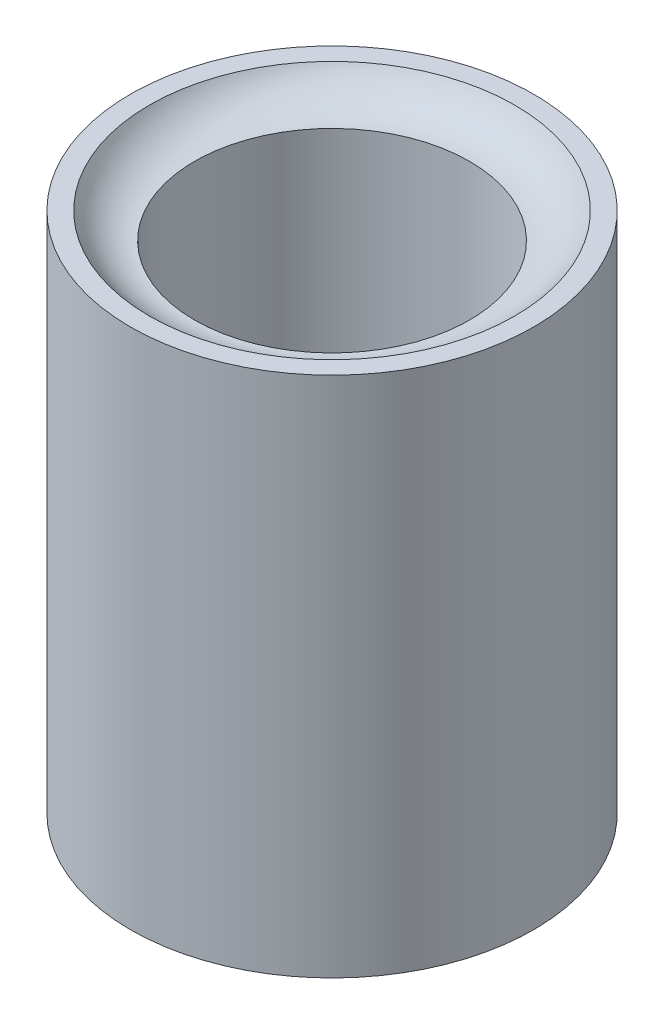
ISO-10303-21;
HEADER;
FILE_DESCRIPTION(('STEP AP214'),'2;1');
FILE_NAME('part.step','',(''),(''),'','','');
FILE_SCHEMA(('AUTOMOTIVE_DESIGN { 1 0 10303 214 1 1 1 1 }'));
ENDSEC;
DATA;
#1=APPLICATION_CONTEXT('core data for automotive mechanical design processes');
#2=APPLICATION_PROTOCOL_DEFINITION('international standard','automotive_design',2000,#1);
#3=PRODUCT_CONTEXT('',#1,'mechanical');
#4=PRODUCT('Part','Part','',(#3));
#5=PRODUCT_RELATED_PRODUCT_CATEGORY('part','',(#4));
#6=PRODUCT_DEFINITION_FORMATION('','',#4);
#7=PRODUCT_DEFINITION_CONTEXT('part definition',#1,'design');
#8=PRODUCT_DEFINITION('design','',#6,#7);
#9=PRODUCT_DEFINITION_SHAPE('','',#8);
#10=(LENGTH_UNIT() NAMED_UNIT(*) SI_UNIT(.MILLI.,.METRE.));
#11=(NAMED_UNIT(*) PLANE_ANGLE_UNIT() SI_UNIT($,.RADIAN.));
#12=(NAMED_UNIT(*) SI_UNIT($,.STERADIAN.) SOLID_ANGLE_UNIT());
#13=UNCERTAINTY_MEASURE_WITH_UNIT(LENGTH_MEASURE(1.E-05),#10,'distance_accuracy_value','');
#14=(GEOMETRIC_REPRESENTATION_CONTEXT(3) GLOBAL_UNCERTAINTY_ASSIGNED_CONTEXT((#13)) GLOBAL_UNIT_ASSIGNED_CONTEXT((#10,
#11,#12)) REPRESENTATION_CONTEXT('',''));
#15=CARTESIAN_POINT('',(0.,0.,0.));
#16=DIRECTION('',(0.,0.,1.));
#17=DIRECTION('',(1.,0.,0.));
#18=AXIS2_PLACEMENT_3D('',#15,#16,#17);
#19=CARTESIAN_POINT('',(0.,100.,0.));
#20=DIRECTION('',(0.,-1.,0.));
#21=DIRECTION('',(0.,0.,-1.));
#22=AXIS2_PLACEMENT_3D('',#19,#20,#21);
#23=CYLINDRICAL_SURFACE('',#22,38.625);
#24=CARTESIAN_POINT('',(0.,100.,0.));
#25=DIRECTION('',(0.,1.,0.));
#26=DIRECTION('',(0.,0.,1.));
#27=AXIS2_PLACEMENT_3D('',#24,#25,#26);
#28=CIRCLE('',#27,38.625);
#29=CARTESIAN_POINT('',(0.,100.,38.625));
#30=VERTEX_POINT('',#29);
#31=EDGE_CURVE('E10',#30,#30,#28,.T.);
#32=ORIENTED_EDGE('',*,*,#31,.F.);
#33=EDGE_LOOP('',(#32));
#34=FACE_BOUND('',#33,.T.);
#35=CARTESIAN_POINT('',(0.,0.,0.));
#36=DIRECTION('',(0.,1.,0.));
#37=DIRECTION('',(0.,0.,1.));
#38=AXIS2_PLACEMENT_3D('',#35,#36,#37);
#39=CIRCLE('',#38,38.625);
#40=CARTESIAN_POINT('',(0.,0.,38.625));
#41=VERTEX_POINT('',#40);
#42=EDGE_CURVE('E35',#41,#41,#39,.T.);
#43=ORIENTED_EDGE('',*,*,#42,.T.);
#44=EDGE_LOOP('',(#43));
#45=FACE_BOUND('',#44,.T.);
#46=ADVANCED_FACE('F31',(#34,#45),#23,.T.);
#47=CARTESIAN_POINT('',(0.,100.,0.));
#48=DIRECTION('',(0.,1.,0.));
#49=DIRECTION('',(0.,0.,1.));
#50=AXIS2_PLACEMENT_3D('',#47,#48,#49);
#51=PLANE('',#50);
#52=CARTESIAN_POINT('',(0.,100.,0.));
#53=DIRECTION('',(0.,1.,0.));
#54=DIRECTION('',(0.,0.,1.));
#55=AXIS2_PLACEMENT_3D('',#52,#53,#54);
#56=CIRCLE('',#55,35.);
#57=CARTESIAN_POINT('',(0.,100.,35.));
#58=VERTEX_POINT('',#57);
#59=EDGE_CURVE('E42',#58,#58,#56,.T.);
#60=ORIENTED_EDGE('',*,*,#59,.F.);
#61=EDGE_LOOP('',(#60));
#62=FACE_BOUND('',#61,.T.);
#63=ORIENTED_EDGE('',*,*,#31,.T.);
#64=EDGE_LOOP('',(#63));
#65=FACE_BOUND('',#64,.T.);
#66=ADVANCED_FACE('F64',(#62,#65),#51,.T.);
#67=CARTESIAN_POINT('',(0.,0.,0.));
#68=DIRECTION('',(0.,1.,0.));
#69=DIRECTION('',(0.,0.,1.));
#70=AXIS2_PLACEMENT_3D('',#67,#68,#69);
#71=PLANE('',#70);
#72=CARTESIAN_POINT('',(0.,0.,0.));
#73=DIRECTION('',(0.,1.,0.));
#74=DIRECTION('',(0.,0.,1.));
#75=AXIS2_PLACEMENT_3D('',#72,#73,#74);
#76=CIRCLE('',#75,26.3397459621556);
#77=CARTESIAN_POINT('',(0.,0.,26.3397459621556));
#78=VERTEX_POINT('',#77);
#79=EDGE_CURVE('E46',#78,#78,#76,.T.);
#80=ORIENTED_EDGE('',*,*,#79,.T.);
#81=EDGE_LOOP('',(#80));
#82=FACE_BOUND('',#81,.T.);
#83=ORIENTED_EDGE('',*,*,#42,.F.);
#84=EDGE_LOOP('',(#83));
#85=FACE_BOUND('',#84,.T.);
#86=ADVANCED_FACE('F57',(#82,#85),#71,.F.);
#87=CARTESIAN_POINT('',(0.,105.,0.));
#88=DIRECTION('',(0.,-1.,0.));
#89=DIRECTION('',(0.,0.,-1.));
#90=AXIS2_PLACEMENT_3D('',#87,#88,#89);
#91=TOROIDAL_SURFACE('',#90,26.3397459621556,10.);
#92=ORIENTED_EDGE('',*,*,#59,.T.);
#93=EDGE_LOOP('',(#92));
#94=FACE_BOUND('',#93,.T.);
#95=CARTESIAN_POINT('',(0.,95.,0.));
#96=DIRECTION('',(0.,1.,0.));
#97=DIRECTION('',(0.,0.,1.));
#98=AXIS2_PLACEMENT_3D('',#95,#96,#97);
#99=CIRCLE('',#98,26.3397459621556);
#100=CARTESIAN_POINT('',(0.,95.,26.3397459621556));
#101=VERTEX_POINT('',#100);
#102=EDGE_CURVE('E49',#101,#101,#99,.T.);
#103=ORIENTED_EDGE('',*,*,#102,.F.);
#104=EDGE_LOOP('',(#103));
#105=FACE_BOUND('',#104,.T.);
#106=ADVANCED_FACE('F33',(#94,#105),#91,.F.);
#107=CARTESIAN_POINT('',(0.,-2.66537930099354,0.));
#108=DIRECTION('',(0.,1.,0.));
#109=DIRECTION('',(0.,0.,1.));
#110=AXIS2_PLACEMENT_3D('',#107,#108,#109);
#111=CYLINDRICAL_SURFACE('',#110,26.3397459621556);
#112=ORIENTED_EDGE('',*,*,#102,.T.);
#113=EDGE_LOOP('',(#112));
#114=FACE_BOUND('',#113,.T.);
#115=ORIENTED_EDGE('',*,*,#79,.F.);
#116=EDGE_LOOP('',(#115));
#117=FACE_BOUND('',#116,.T.);
#118=ADVANCED_FACE('F53',(#114,#117),#111,.F.);
#119=CLOSED_SHELL('',(#46,#66,#86,#106,#118));
#120=MANIFOLD_SOLID_BREP('B2',#119);
#121=ADVANCED_BREP_SHAPE_REPRESENTATION('',(#18,#120),#14);
#122=SHAPE_DEFINITION_REPRESENTATION(#9,#121);
ENDSEC;
END-ISO-10303-21;
